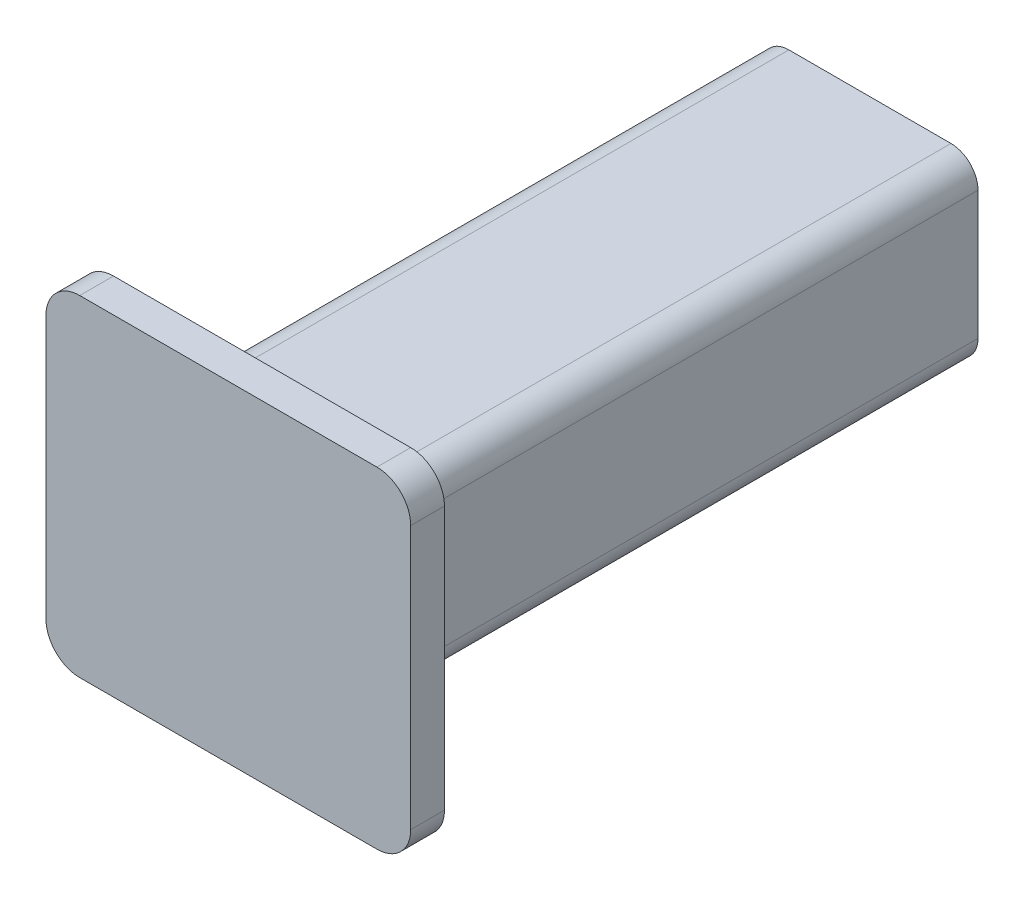
ISO-10303-21;
HEADER;
FILE_DESCRIPTION(('STEP AP214'),'2;1');
FILE_NAME('part.step','',(''),(''),'','','');
FILE_SCHEMA(('AUTOMOTIVE_DESIGN { 1 0 10303 214 1 1 1 1 }'));
ENDSEC;
DATA;
#1=APPLICATION_CONTEXT('core data for automotive mechanical design processes');
#2=APPLICATION_PROTOCOL_DEFINITION('international standard','automotive_design',2000,#1);
#3=PRODUCT_CONTEXT('',#1,'mechanical');
#4=PRODUCT('Part','Part','',(#3));
#5=PRODUCT_RELATED_PRODUCT_CATEGORY('part','',(#4));
#6=PRODUCT_DEFINITION_FORMATION('','',#4);
#7=PRODUCT_DEFINITION_CONTEXT('part definition',#1,'design');
#8=PRODUCT_DEFINITION('design','',#6,#7);
#9=PRODUCT_DEFINITION_SHAPE('','',#8);
#10=(LENGTH_UNIT() NAMED_UNIT(*) SI_UNIT(.MILLI.,.METRE.));
#11=(NAMED_UNIT(*) PLANE_ANGLE_UNIT() SI_UNIT($,.RADIAN.));
#12=(NAMED_UNIT(*) SI_UNIT($,.STERADIAN.) SOLID_ANGLE_UNIT());
#13=UNCERTAINTY_MEASURE_WITH_UNIT(LENGTH_MEASURE(1.E-05),#10,'distance_accuracy_value','');
#14=(GEOMETRIC_REPRESENTATION_CONTEXT(3) GLOBAL_UNCERTAINTY_ASSIGNED_CONTEXT((#13)) GLOBAL_UNIT_ASSIGNED_CONTEXT((#10,
#11,#12)) REPRESENTATION_CONTEXT('',''));
#15=CARTESIAN_POINT('',(0.,0.,0.));
#16=DIRECTION('',(0.,0.,1.));
#17=DIRECTION('',(1.,0.,0.));
#18=AXIS2_PLACEMENT_3D('',#15,#16,#17);
#19=CARTESIAN_POINT('',(5.66715121239576,-1.47845303106902,0.));
#20=DIRECTION('',(0.,0.,1.));
#21=DIRECTION('',(1.,0.,0.));
#22=AXIS2_PLACEMENT_3D('',#19,#20,#21);
#23=PLANE('',#22);
#24=CARTESIAN_POINT('',(5.66715121239576,-1.47845303106902,0.));
#25=DIRECTION('',(0.,0.,1.));
#26=DIRECTION('',(1.,0.,0.));
#27=AXIS2_PLACEMENT_3D('',#24,#25,#26);
#28=CIRCLE('',#27,1.);
#29=CARTESIAN_POINT('',(5.66715121239576,-2.47845303106902,0.));
#30=VERTEX_POINT('',#29);
#31=CARTESIAN_POINT('',(6.66715121239576,-1.47845303106902,0.));
#32=VERTEX_POINT('',#31);
#33=EDGE_CURVE('E178',#30,#32,#28,.T.);
#34=ORIENTED_EDGE('',*,*,#33,.F.);
#35=DIRECTION('',(1.,0.,0.));
#36=VECTOR('',#35,1.);
#37=CARTESIAN_POINT('',(-3.13284878760424,-2.47845303106902,0.));
#38=LINE('',#37,#36);
#39=CARTESIAN_POINT('',(-3.13284878760424,-2.47845303106902,0.));
#40=VERTEX_POINT('',#39);
#41=EDGE_CURVE('E191',#40,#30,#38,.T.);
#42=ORIENTED_EDGE('',*,*,#41,.F.);
#43=CARTESIAN_POINT('',(-3.13284878760424,-1.47845303106902,0.));
#44=DIRECTION('',(0.,0.,1.));
#45=DIRECTION('',(1.,0.,0.));
#46=AXIS2_PLACEMENT_3D('',#43,#44,#45);
#47=CIRCLE('',#46,1.);
#48=CARTESIAN_POINT('',(-4.13284878760424,-1.47845303106901,0.));
#49=VERTEX_POINT('',#48);
#50=EDGE_CURVE('E215',#49,#40,#47,.T.);
#51=ORIENTED_EDGE('',*,*,#50,.F.);
#52=DIRECTION('',(0.,-1.,0.));
#53=VECTOR('',#52,1.);
#54=CARTESIAN_POINT('',(-4.13284878760424,6.32154696893098,0.));
#55=LINE('',#54,#53);
#56=CARTESIAN_POINT('',(-4.13284878760424,6.32154696893098,0.));
#57=VERTEX_POINT('',#56);
#58=EDGE_CURVE('E213',#57,#49,#55,.T.);
#59=ORIENTED_EDGE('',*,*,#58,.F.);
#60=CARTESIAN_POINT('',(-3.13284878760424,6.32154696893098,0.));
#61=DIRECTION('',(0.,0.,1.));
#62=DIRECTION('',(1.,0.,0.));
#63=AXIS2_PLACEMENT_3D('',#60,#61,#62);
#64=CIRCLE('',#63,1.);
#65=CARTESIAN_POINT('',(-3.13284878760424,7.32154696893098,0.));
#66=VERTEX_POINT('',#65);
#67=EDGE_CURVE('E211',#66,#57,#64,.T.);
#68=ORIENTED_EDGE('',*,*,#67,.F.);
#69=DIRECTION('',(-1.,0.,0.));
#70=VECTOR('',#69,1.);
#71=CARTESIAN_POINT('',(-3.13284878760424,7.32154696893098,0.));
#72=LINE('',#71,#70);
#73=CARTESIAN_POINT('',(5.66715121239576,7.32154696893098,0.));
#74=VERTEX_POINT('',#73);
#75=EDGE_CURVE('E209',#74,#66,#72,.T.);
#76=ORIENTED_EDGE('',*,*,#75,.F.);
#77=CARTESIAN_POINT('',(5.66715121239576,6.32154696893098,0.));
#78=DIRECTION('',(0.,0.,1.));
#79=DIRECTION('',(-1.,0.,0.));
#80=AXIS2_PLACEMENT_3D('',#77,#78,#79);
#81=CIRCLE('',#80,1.);
#82=CARTESIAN_POINT('',(6.66715121239576,6.32154696893098,0.));
#83=VERTEX_POINT('',#82);
#84=EDGE_CURVE('E207',#83,#74,#81,.T.);
#85=ORIENTED_EDGE('',*,*,#84,.F.);
#86=DIRECTION('',(0.,1.,0.));
#87=VECTOR('',#86,1.);
#88=CARTESIAN_POINT('',(6.66715121239576,6.32154696893098,0.));
#89=LINE('',#88,#87);
#90=EDGE_CURVE('E181',#32,#83,#89,.T.);
#91=ORIENTED_EDGE('',*,*,#90,.F.);
#92=EDGE_LOOP('',(#34,#42,#51,#59,#68,#76,#85,#91));
#93=FACE_BOUND('',#92,.T.);
#94=CARTESIAN_POINT('',(3.66715121239576,0.52154696893098,0.));
#95=DIRECTION('',(0.,0.,-1.));
#96=DIRECTION('',(-1.,0.,0.));
#97=AXIS2_PLACEMENT_3D('',#94,#95,#96);
#98=CIRCLE('',#97,0.8);
#99=CARTESIAN_POINT('',(4.46715121239576,0.52154696893098,0.));
#100=VERTEX_POINT('',#99);
#101=CARTESIAN_POINT('',(3.66715121239576,-0.27845303106902,0.));
#102=VERTEX_POINT('',#101);
#103=EDGE_CURVE('E60',#100,#102,#98,.T.);
#104=ORIENTED_EDGE('',*,*,#103,.F.);
#105=DIRECTION('',(0.,-1.,0.));
#106=VECTOR('',#105,1.);
#107=CARTESIAN_POINT('',(4.46715121239576,4.32154696893098,0.));
#108=LINE('',#107,#106);
#109=CARTESIAN_POINT('',(4.46715121239576,4.32154696893098,0.));
#110=VERTEX_POINT('',#109);
#111=EDGE_CURVE('E64',#110,#100,#108,.T.);
#112=ORIENTED_EDGE('',*,*,#111,.F.);
#113=CARTESIAN_POINT('',(3.66715121239576,4.32154696893098,0.));
#114=DIRECTION('',(0.,0.,-1.));
#115=DIRECTION('',(-1.,0.,0.));
#116=AXIS2_PLACEMENT_3D('',#113,#114,#115);
#117=CIRCLE('',#116,0.8);
#118=CARTESIAN_POINT('',(3.66715121239576,5.12154696893098,0.));
#119=VERTEX_POINT('',#118);
#120=EDGE_CURVE('E441',#119,#110,#117,.T.);
#121=ORIENTED_EDGE('',*,*,#120,.F.);
#122=DIRECTION('',(1.,0.,0.));
#123=VECTOR('',#122,1.);
#124=CARTESIAN_POINT('',(3.66715121239576,5.12154696893098,0.));
#125=LINE('',#124,#123);
#126=CARTESIAN_POINT('',(-1.13284878760424,5.12154696893098,0.));
#127=VERTEX_POINT('',#126);
#128=EDGE_CURVE('E475',#127,#119,#125,.T.);
#129=ORIENTED_EDGE('',*,*,#128,.F.);
#130=CARTESIAN_POINT('',(-1.13284878760424,4.32154696893098,0.));
#131=DIRECTION('',(0.,0.,-1.));
#132=DIRECTION('',(1.,0.,0.));
#133=AXIS2_PLACEMENT_3D('',#130,#131,#132);
#134=CIRCLE('',#133,0.8);
#135=CARTESIAN_POINT('',(-1.93284878760424,4.32154696893098,0.));
#136=VERTEX_POINT('',#135);
#137=EDGE_CURVE('E468',#136,#127,#134,.T.);
#138=ORIENTED_EDGE('',*,*,#137,.F.);
#139=DIRECTION('',(0.,1.,0.));
#140=VECTOR('',#139,1.);
#141=CARTESIAN_POINT('',(-1.93284878760424,4.32154696893098,0.));
#142=LINE('',#141,#140);
#143=CARTESIAN_POINT('',(-1.93284878760424,0.52154696893098,0.));
#144=VERTEX_POINT('',#143);
#145=EDGE_CURVE('E462',#144,#136,#142,.T.);
#146=ORIENTED_EDGE('',*,*,#145,.F.);
#147=CARTESIAN_POINT('',(-1.13284878760424,0.52154696893098,0.));
#148=DIRECTION('',(0.,0.,-1.));
#149=DIRECTION('',(-1.,0.,0.));
#150=AXIS2_PLACEMENT_3D('',#147,#148,#149);
#151=CIRCLE('',#150,0.8);
#152=CARTESIAN_POINT('',(-1.13284878760424,-0.27845303106902,0.));
#153=VERTEX_POINT('',#152);
#154=EDGE_CURVE('E465',#153,#144,#151,.T.);
#155=ORIENTED_EDGE('',*,*,#154,.F.);
#156=DIRECTION('',(-1.,0.,0.));
#157=VECTOR('',#156,1.);
#158=CARTESIAN_POINT('',(3.66715121239576,-0.27845303106902,0.));
#159=LINE('',#158,#157);
#160=EDGE_CURVE('E466',#102,#153,#159,.T.);
#161=ORIENTED_EDGE('',*,*,#160,.F.);
#162=EDGE_LOOP('',(#104,#112,#121,#129,#138,#146,#155,#161));
#163=FACE_BOUND('',#162,.T.);
#164=ADVANCED_FACE('F45',(#93,#163),#23,.F.);
#165=CARTESIAN_POINT('',(5.66715121239576,-1.47845303106902,1.));
#166=DIRECTION('',(0.,0.,-1.));
#167=DIRECTION('',(-1.,0.,0.));
#168=AXIS2_PLACEMENT_3D('',#165,#166,#167);
#169=CYLINDRICAL_SURFACE('',#168,1.);
#170=ORIENTED_EDGE('',*,*,#33,.T.);
#171=DIRECTION('',(0.,0.,-1.));
#172=VECTOR('',#171,1.);
#173=CARTESIAN_POINT('',(6.66715121239576,-1.47845303106902,1.));
#174=LINE('',#173,#172);
#175=CARTESIAN_POINT('',(6.66715121239576,-1.47845303106902,1.));
#176=VERTEX_POINT('',#175);
#177=EDGE_CURVE('E11',#176,#32,#174,.T.);
#178=ORIENTED_EDGE('',*,*,#177,.F.);
#179=CARTESIAN_POINT('',(5.66715121239576,-1.47845303106902,1.));
#180=DIRECTION('',(0.,0.,1.));
#181=DIRECTION('',(1.,0.,0.));
#182=AXIS2_PLACEMENT_3D('',#179,#180,#181);
#183=CIRCLE('',#182,1.);
#184=CARTESIAN_POINT('',(5.66715121239576,-2.47845303106902,1.));
#185=VERTEX_POINT('',#184);
#186=EDGE_CURVE('E187',#185,#176,#183,.T.);
#187=ORIENTED_EDGE('',*,*,#186,.F.);
#188=DIRECTION('',(0.,0.,-1.));
#189=VECTOR('',#188,1.);
#190=CARTESIAN_POINT('',(5.66715121239576,-2.47845303106902,1.));
#191=LINE('',#190,#189);
#192=EDGE_CURVE('E204',#185,#30,#191,.T.);
#193=ORIENTED_EDGE('',*,*,#192,.T.);
#194=EDGE_LOOP('',(#170,#178,#187,#193));
#195=FACE_BOUND('',#194,.T.);
#196=ADVANCED_FACE('F47',(#195),#169,.T.);
#197=CARTESIAN_POINT('',(6.66715121239576,6.32154696893098,1.));
#198=DIRECTION('',(-1.,0.,0.));
#199=DIRECTION('',(0.,-1.,0.));
#200=AXIS2_PLACEMENT_3D('',#197,#198,#199);
#201=PLANE('',#200);
#202=ORIENTED_EDGE('',*,*,#90,.T.);
#203=DIRECTION('',(0.,0.,-1.));
#204=VECTOR('',#203,1.);
#205=CARTESIAN_POINT('',(6.66715121239576,6.32154696893098,1.));
#206=LINE('',#205,#204);
#207=CARTESIAN_POINT('',(6.66715121239576,6.32154696893098,1.));
#208=VERTEX_POINT('',#207);
#209=EDGE_CURVE('E53',#208,#83,#206,.T.);
#210=ORIENTED_EDGE('',*,*,#209,.F.);
#211=DIRECTION('',(0.,1.,0.));
#212=VECTOR('',#211,1.);
#213=CARTESIAN_POINT('',(6.66715121239576,6.32154696893098,1.));
#214=LINE('',#213,#212);
#215=EDGE_CURVE('E190',#176,#208,#214,.T.);
#216=ORIENTED_EDGE('',*,*,#215,.F.);
#217=ORIENTED_EDGE('',*,*,#177,.T.);
#218=EDGE_LOOP('',(#202,#210,#216,#217));
#219=FACE_BOUND('',#218,.T.);
#220=ADVANCED_FACE('F261',(#219),#201,.F.);
#221=CARTESIAN_POINT('',(5.66715121239576,6.32154696893098,1.));
#222=DIRECTION('',(0.,0.,-1.));
#223=DIRECTION('',(-1.,0.,0.));
#224=AXIS2_PLACEMENT_3D('',#221,#222,#223);
#225=CYLINDRICAL_SURFACE('',#224,1.);
#226=ORIENTED_EDGE('',*,*,#84,.T.);
#227=DIRECTION('',(0.,0.,-1.));
#228=VECTOR('',#227,1.);
#229=CARTESIAN_POINT('',(5.66715121239576,7.32154696893098,1.));
#230=LINE('',#229,#228);
#231=CARTESIAN_POINT('',(5.66715121239576,7.32154696893098,1.));
#232=VERTEX_POINT('',#231);
#233=EDGE_CURVE('E232',#232,#74,#230,.T.);
#234=ORIENTED_EDGE('',*,*,#233,.F.);
#235=CARTESIAN_POINT('',(5.66715121239576,6.32154696893098,1.));
#236=DIRECTION('',(0.,0.,1.));
#237=DIRECTION('',(-1.,0.,0.));
#238=AXIS2_PLACEMENT_3D('',#235,#236,#237);
#239=CIRCLE('',#238,1.);
#240=EDGE_CURVE('E193',#208,#232,#239,.T.);
#241=ORIENTED_EDGE('',*,*,#240,.F.);
#242=ORIENTED_EDGE('',*,*,#209,.T.);
#243=EDGE_LOOP('',(#226,#234,#241,#242));
#244=FACE_BOUND('',#243,.T.);
#245=ADVANCED_FACE('F239',(#244),#225,.T.);
#246=CARTESIAN_POINT('',(-3.13284878760424,7.32154696893098,1.));
#247=DIRECTION('',(0.,-1.,0.));
#248=DIRECTION('',(0.,0.,-1.));
#249=AXIS2_PLACEMENT_3D('',#246,#247,#248);
#250=PLANE('',#249);
#251=ORIENTED_EDGE('',*,*,#75,.T.);
#252=DIRECTION('',(0.,0.,-1.));
#253=VECTOR('',#252,1.);
#254=CARTESIAN_POINT('',(-3.13284878760424,7.32154696893098,1.));
#255=LINE('',#254,#253);
#256=CARTESIAN_POINT('',(-3.13284878760424,7.32154696893098,1.));
#257=VERTEX_POINT('',#256);
#258=EDGE_CURVE('E229',#257,#66,#255,.T.);
#259=ORIENTED_EDGE('',*,*,#258,.F.);
#260=DIRECTION('',(-1.,0.,0.));
#261=VECTOR('',#260,1.);
#262=CARTESIAN_POINT('',(-3.13284878760424,7.32154696893098,1.));
#263=LINE('',#262,#261);
#264=EDGE_CURVE('E195',#232,#257,#263,.T.);
#265=ORIENTED_EDGE('',*,*,#264,.F.);
#266=ORIENTED_EDGE('',*,*,#233,.T.);
#267=EDGE_LOOP('',(#251,#259,#265,#266));
#268=FACE_BOUND('',#267,.T.);
#269=ADVANCED_FACE('F249',(#268),#250,.F.);
#270=CARTESIAN_POINT('',(-3.13284878760424,6.32154696893098,1.));
#271=DIRECTION('',(0.,0.,-1.));
#272=DIRECTION('',(-1.,0.,0.));
#273=AXIS2_PLACEMENT_3D('',#270,#271,#272);
#274=CYLINDRICAL_SURFACE('',#273,1.);
#275=ORIENTED_EDGE('',*,*,#67,.T.);
#276=DIRECTION('',(0.,0.,-1.));
#277=VECTOR('',#276,1.);
#278=CARTESIAN_POINT('',(-4.13284878760424,6.32154696893098,1.));
#279=LINE('',#278,#277);
#280=CARTESIAN_POINT('',(-4.13284878760424,6.32154696893098,1.));
#281=VERTEX_POINT('',#280);
#282=EDGE_CURVE('E226',#281,#57,#279,.T.);
#283=ORIENTED_EDGE('',*,*,#282,.F.);
#284=CARTESIAN_POINT('',(-3.13284878760424,6.32154696893098,1.));
#285=DIRECTION('',(0.,0.,1.));
#286=DIRECTION('',(1.,0.,0.));
#287=AXIS2_PLACEMENT_3D('',#284,#285,#286);
#288=CIRCLE('',#287,1.);
#289=EDGE_CURVE('E197',#257,#281,#288,.T.);
#290=ORIENTED_EDGE('',*,*,#289,.F.);
#291=ORIENTED_EDGE('',*,*,#258,.T.);
#292=EDGE_LOOP('',(#275,#283,#290,#291));
#293=FACE_BOUND('',#292,.T.);
#294=ADVANCED_FACE('F253',(#293),#274,.T.);
#295=CARTESIAN_POINT('',(-4.13284878760424,6.32154696893098,1.));
#296=DIRECTION('',(1.,0.,0.));
#297=DIRECTION('',(0.,0.,-1.));
#298=AXIS2_PLACEMENT_3D('',#295,#296,#297);
#299=PLANE('',#298);
#300=ORIENTED_EDGE('',*,*,#58,.T.);
#301=DIRECTION('',(0.,0.,-1.));
#302=VECTOR('',#301,1.);
#303=CARTESIAN_POINT('',(-4.13284878760424,-1.47845303106901,1.));
#304=LINE('',#303,#302);
#305=CARTESIAN_POINT('',(-4.13284878760424,-1.47845303106901,1.));
#306=VERTEX_POINT('',#305);
#307=EDGE_CURVE('E223',#306,#49,#304,.T.);
#308=ORIENTED_EDGE('',*,*,#307,.F.);
#309=DIRECTION('',(0.,-1.,0.));
#310=VECTOR('',#309,1.);
#311=CARTESIAN_POINT('',(-4.13284878760424,6.32154696893098,1.));
#312=LINE('',#311,#310);
#313=EDGE_CURVE('E199',#281,#306,#312,.T.);
#314=ORIENTED_EDGE('',*,*,#313,.F.);
#315=ORIENTED_EDGE('',*,*,#282,.T.);
#316=EDGE_LOOP('',(#300,#308,#314,#315));
#317=FACE_BOUND('',#316,.T.);
#318=ADVANCED_FACE('F274',(#317),#299,.F.);
#319=CARTESIAN_POINT('',(-3.13284878760424,-1.47845303106902,1.));
#320=DIRECTION('',(0.,0.,-1.));
#321=DIRECTION('',(-1.,0.,0.));
#322=AXIS2_PLACEMENT_3D('',#319,#320,#321);
#323=CYLINDRICAL_SURFACE('',#322,1.);
#324=ORIENTED_EDGE('',*,*,#50,.T.);
#325=DIRECTION('',(0.,0.,-1.));
#326=VECTOR('',#325,1.);
#327=CARTESIAN_POINT('',(-3.13284878760424,-2.47845303106902,1.));
#328=LINE('',#327,#326);
#329=CARTESIAN_POINT('',(-3.13284878760424,-2.47845303106902,1.));
#330=VERTEX_POINT('',#329);
#331=EDGE_CURVE('E220',#330,#40,#328,.T.);
#332=ORIENTED_EDGE('',*,*,#331,.F.);
#333=CARTESIAN_POINT('',(-3.13284878760424,-1.47845303106902,1.));
#334=DIRECTION('',(0.,0.,1.));
#335=DIRECTION('',(1.,0.,0.));
#336=AXIS2_PLACEMENT_3D('',#333,#334,#335);
#337=CIRCLE('',#336,1.);
#338=EDGE_CURVE('E201',#306,#330,#337,.T.);
#339=ORIENTED_EDGE('',*,*,#338,.F.);
#340=ORIENTED_EDGE('',*,*,#307,.T.);
#341=EDGE_LOOP('',(#324,#332,#339,#340));
#342=FACE_BOUND('',#341,.T.);
#343=ADVANCED_FACE('F272',(#342),#323,.T.);
#344=CARTESIAN_POINT('',(-3.13284878760424,-2.47845303106902,1.));
#345=DIRECTION('',(0.,1.,0.));
#346=DIRECTION('',(-1.,0.,0.));
#347=AXIS2_PLACEMENT_3D('',#344,#345,#346);
#348=PLANE('',#347);
#349=ORIENTED_EDGE('',*,*,#41,.T.);
#350=ORIENTED_EDGE('',*,*,#192,.F.);
#351=DIRECTION('',(1.,0.,0.));
#352=VECTOR('',#351,1.);
#353=CARTESIAN_POINT('',(-3.13284878760424,-2.47845303106902,1.));
#354=LINE('',#353,#352);
#355=EDGE_CURVE('E203',#330,#185,#354,.T.);
#356=ORIENTED_EDGE('',*,*,#355,.F.);
#357=ORIENTED_EDGE('',*,*,#331,.T.);
#358=EDGE_LOOP('',(#349,#350,#356,#357));
#359=FACE_BOUND('',#358,.T.);
#360=ADVANCED_FACE('F267',(#359),#348,.F.);
#361=CARTESIAN_POINT('',(5.66715121239576,-1.47845303106902,1.));
#362=DIRECTION('',(0.,0.,1.));
#363=DIRECTION('',(1.,0.,0.));
#364=AXIS2_PLACEMENT_3D('',#361,#362,#363);
#365=PLANE('',#364);
#366=ORIENTED_EDGE('',*,*,#186,.T.);
#367=ORIENTED_EDGE('',*,*,#215,.T.);
#368=ORIENTED_EDGE('',*,*,#240,.T.);
#369=ORIENTED_EDGE('',*,*,#264,.T.);
#370=ORIENTED_EDGE('',*,*,#289,.T.);
#371=ORIENTED_EDGE('',*,*,#313,.T.);
#372=ORIENTED_EDGE('',*,*,#338,.T.);
#373=ORIENTED_EDGE('',*,*,#355,.T.);
#374=EDGE_LOOP('',(#366,#367,#368,#369,#370,#371,#372,#373));
#375=FACE_BOUND('',#374,.T.);
#376=ADVANCED_FACE('F257',(#375),#365,.T.);
#377=CARTESIAN_POINT('',(3.66715121239576,0.52154696893098,-18.));
#378=DIRECTION('',(0.,0.,1.));
#379=DIRECTION('',(1.,0.,0.));
#380=AXIS2_PLACEMENT_3D('',#377,#378,#379);
#381=CYLINDRICAL_SURFACE('',#380,0.8);
#382=ORIENTED_EDGE('',*,*,#103,.T.);
#383=DIRECTION('',(0.,0.,1.));
#384=VECTOR('',#383,1.);
#385=CARTESIAN_POINT('',(3.66715121239576,-0.27845303106902,-18.));
#386=LINE('',#385,#384);
#387=CARTESIAN_POINT('',(3.66715121239576,-0.27845303106902,-18.));
#388=VERTEX_POINT('',#387);
#389=EDGE_CURVE('E161',#388,#102,#386,.T.);
#390=ORIENTED_EDGE('',*,*,#389,.F.);
#391=CARTESIAN_POINT('',(3.66715121239576,0.52154696893098,-18.));
#392=DIRECTION('',(0.,0.,-1.));
#393=DIRECTION('',(-1.,0.,0.));
#394=AXIS2_PLACEMENT_3D('',#391,#392,#393);
#395=CIRCLE('',#394,0.8);
#396=CARTESIAN_POINT('',(4.46715121239576,0.52154696893098,-18.));
#397=VERTEX_POINT('',#396);
#398=EDGE_CURVE('E167',#397,#388,#395,.T.);
#399=ORIENTED_EDGE('',*,*,#398,.F.);
#400=DIRECTION('',(0.,0.,1.));
#401=VECTOR('',#400,1.);
#402=CARTESIAN_POINT('',(4.46715121239576,0.52154696893098,-18.));
#403=LINE('',#402,#401);
#404=EDGE_CURVE('E438',#397,#100,#403,.T.);
#405=ORIENTED_EDGE('',*,*,#404,.T.);
#406=EDGE_LOOP('',(#382,#390,#399,#405));
#407=FACE_BOUND('',#406,.T.);
#408=ADVANCED_FACE('F177',(#407),#381,.T.);
#409=CARTESIAN_POINT('',(3.66715121239576,-0.27845303106902,-18.));
#410=DIRECTION('',(0.,1.,0.));
#411=DIRECTION('',(0.,0.,1.));
#412=AXIS2_PLACEMENT_3D('',#409,#410,#411);
#413=PLANE('',#412);
#414=ORIENTED_EDGE('',*,*,#160,.T.);
#415=DIRECTION('',(0.,0.,1.));
#416=VECTOR('',#415,1.);
#417=CARTESIAN_POINT('',(-1.13284878760424,-0.27845303106902,-18.));
#418=LINE('',#417,#416);
#419=CARTESIAN_POINT('',(-1.13284878760424,-0.27845303106902,-18.));
#420=VERTEX_POINT('',#419);
#421=EDGE_CURVE('E163',#420,#153,#418,.T.);
#422=ORIENTED_EDGE('',*,*,#421,.F.);
#423=DIRECTION('',(-1.,0.,0.));
#424=VECTOR('',#423,1.);
#425=CARTESIAN_POINT('',(3.66715121239576,-0.27845303106902,-18.));
#426=LINE('',#425,#424);
#427=EDGE_CURVE('E156',#388,#420,#426,.T.);
#428=ORIENTED_EDGE('',*,*,#427,.F.);
#429=ORIENTED_EDGE('',*,*,#389,.T.);
#430=EDGE_LOOP('',(#414,#422,#428,#429));
#431=FACE_BOUND('',#430,.T.);
#432=ADVANCED_FACE('F159',(#431),#413,.F.);
#433=CARTESIAN_POINT('',(-1.13284878760424,0.52154696893098,-18.));
#434=DIRECTION('',(0.,0.,1.));
#435=DIRECTION('',(1.,0.,0.));
#436=AXIS2_PLACEMENT_3D('',#433,#434,#435);
#437=CYLINDRICAL_SURFACE('',#436,0.8);
#438=ORIENTED_EDGE('',*,*,#154,.T.);
#439=DIRECTION('',(0.,0.,1.));
#440=VECTOR('',#439,1.);
#441=CARTESIAN_POINT('',(-1.93284878760424,0.52154696893098,-18.));
#442=LINE('',#441,#440);
#443=CARTESIAN_POINT('',(-1.93284878760424,0.52154696893098,-18.));
#444=VERTEX_POINT('',#443);
#445=EDGE_CURVE('E183',#444,#144,#442,.T.);
#446=ORIENTED_EDGE('',*,*,#445,.F.);
#447=CARTESIAN_POINT('',(-1.13284878760424,0.52154696893098,-18.));
#448=DIRECTION('',(0.,0.,-1.));
#449=DIRECTION('',(-1.,0.,0.));
#450=AXIS2_PLACEMENT_3D('',#447,#448,#449);
#451=CIRCLE('',#450,0.8);
#452=EDGE_CURVE('E166',#420,#444,#451,.T.);
#453=ORIENTED_EDGE('',*,*,#452,.F.);
#454=ORIENTED_EDGE('',*,*,#421,.T.);
#455=EDGE_LOOP('',(#438,#446,#453,#454));
#456=FACE_BOUND('',#455,.T.);
#457=ADVANCED_FACE('F301',(#456),#437,.T.);
#458=CARTESIAN_POINT('',(-1.93284878760424,4.32154696893098,-18.));
#459=DIRECTION('',(1.,0.,0.));
#460=DIRECTION('',(0.,1.,0.));
#461=AXIS2_PLACEMENT_3D('',#458,#459,#460);
#462=PLANE('',#461);
#463=ORIENTED_EDGE('',*,*,#145,.T.);
#464=DIRECTION('',(0.,0.,1.));
#465=VECTOR('',#464,1.);
#466=CARTESIAN_POINT('',(-1.93284878760424,4.32154696893098,-18.));
#467=LINE('',#466,#465);
#468=CARTESIAN_POINT('',(-1.93284878760424,4.32154696893098,-18.));
#469=VERTEX_POINT('',#468);
#470=EDGE_CURVE('E455',#469,#136,#467,.T.);
#471=ORIENTED_EDGE('',*,*,#470,.F.);
#472=DIRECTION('',(0.,1.,0.));
#473=VECTOR('',#472,1.);
#474=CARTESIAN_POINT('',(-1.93284878760424,4.32154696893098,-18.));
#475=LINE('',#474,#473);
#476=EDGE_CURVE('E463',#444,#469,#475,.T.);
#477=ORIENTED_EDGE('',*,*,#476,.F.);
#478=ORIENTED_EDGE('',*,*,#445,.T.);
#479=EDGE_LOOP('',(#463,#471,#477,#478));
#480=FACE_BOUND('',#479,.T.);
#481=ADVANCED_FACE('F306',(#480),#462,.F.);
#482=CARTESIAN_POINT('',(-1.13284878760424,4.32154696893098,-18.));
#483=DIRECTION('',(0.,0.,1.));
#484=DIRECTION('',(1.,0.,0.));
#485=AXIS2_PLACEMENT_3D('',#482,#483,#484);
#486=CYLINDRICAL_SURFACE('',#485,0.8);
#487=ORIENTED_EDGE('',*,*,#137,.T.);
#488=DIRECTION('',(0.,0.,1.));
#489=VECTOR('',#488,1.);
#490=CARTESIAN_POINT('',(-1.13284878760424,5.12154696893098,-18.));
#491=LINE('',#490,#489);
#492=CARTESIAN_POINT('',(-1.13284878760424,5.12154696893098,-18.));
#493=VERTEX_POINT('',#492);
#494=EDGE_CURVE('E452',#493,#127,#491,.T.);
#495=ORIENTED_EDGE('',*,*,#494,.F.);
#496=CARTESIAN_POINT('',(-1.13284878760424,4.32154696893098,-18.));
#497=DIRECTION('',(0.,0.,-1.));
#498=DIRECTION('',(1.,0.,0.));
#499=AXIS2_PLACEMENT_3D('',#496,#497,#498);
#500=CIRCLE('',#499,0.8);
#501=EDGE_CURVE('E483',#469,#493,#500,.T.);
#502=ORIENTED_EDGE('',*,*,#501,.F.);
#503=ORIENTED_EDGE('',*,*,#470,.T.);
#504=EDGE_LOOP('',(#487,#495,#502,#503));
#505=FACE_BOUND('',#504,.T.);
#506=ADVANCED_FACE('F310',(#505),#486,.T.);
#507=CARTESIAN_POINT('',(3.66715121239576,5.12154696893098,-18.));
#508=DIRECTION('',(0.,-1.,0.));
#509=DIRECTION('',(0.,0.,-1.));
#510=AXIS2_PLACEMENT_3D('',#507,#508,#509);
#511=PLANE('',#510);
#512=ORIENTED_EDGE('',*,*,#128,.T.);
#513=DIRECTION('',(0.,0.,1.));
#514=VECTOR('',#513,1.);
#515=CARTESIAN_POINT('',(3.66715121239576,5.12154696893098,-18.));
#516=LINE('',#515,#514);
#517=CARTESIAN_POINT('',(3.66715121239576,5.12154696893098,-18.));
#518=VERTEX_POINT('',#517);
#519=EDGE_CURVE('E444',#518,#119,#516,.T.);
#520=ORIENTED_EDGE('',*,*,#519,.F.);
#521=DIRECTION('',(1.,0.,0.));
#522=VECTOR('',#521,1.);
#523=CARTESIAN_POINT('',(3.66715121239576,5.12154696893098,-18.));
#524=LINE('',#523,#522);
#525=EDGE_CURVE('E481',#493,#518,#524,.T.);
#526=ORIENTED_EDGE('',*,*,#525,.F.);
#527=ORIENTED_EDGE('',*,*,#494,.T.);
#528=EDGE_LOOP('',(#512,#520,#526,#527));
#529=FACE_BOUND('',#528,.T.);
#530=ADVANCED_FACE('F314',(#529),#511,.F.);
#531=CARTESIAN_POINT('',(3.66715121239576,4.32154696893098,-18.));
#532=DIRECTION('',(0.,0.,1.));
#533=DIRECTION('',(1.,0.,0.));
#534=AXIS2_PLACEMENT_3D('',#531,#532,#533);
#535=CYLINDRICAL_SURFACE('',#534,0.8);
#536=ORIENTED_EDGE('',*,*,#120,.T.);
#537=DIRECTION('',(0.,0.,1.));
#538=VECTOR('',#537,1.);
#539=CARTESIAN_POINT('',(4.46715121239576,4.32154696893098,-18.));
#540=LINE('',#539,#538);
#541=CARTESIAN_POINT('',(4.46715121239576,4.32154696893098,-18.));
#542=VERTEX_POINT('',#541);
#543=EDGE_CURVE('E440',#542,#110,#540,.T.);
#544=ORIENTED_EDGE('',*,*,#543,.F.);
#545=CARTESIAN_POINT('',(3.66715121239576,4.32154696893098,-18.));
#546=DIRECTION('',(0.,0.,-1.));
#547=DIRECTION('',(-1.,0.,0.));
#548=AXIS2_PLACEMENT_3D('',#545,#546,#547);
#549=CIRCLE('',#548,0.8);
#550=EDGE_CURVE('E446',#518,#542,#549,.T.);
#551=ORIENTED_EDGE('',*,*,#550,.F.);
#552=ORIENTED_EDGE('',*,*,#519,.T.);
#553=EDGE_LOOP('',(#536,#544,#551,#552));
#554=FACE_BOUND('',#553,.T.);
#555=ADVANCED_FACE('F318',(#554),#535,.T.);
#556=CARTESIAN_POINT('',(4.46715121239576,4.32154696893098,-18.));
#557=DIRECTION('',(-1.,0.,0.));
#558=DIRECTION('',(0.,0.,1.));
#559=AXIS2_PLACEMENT_3D('',#556,#557,#558);
#560=PLANE('',#559);
#561=ORIENTED_EDGE('',*,*,#111,.T.);
#562=ORIENTED_EDGE('',*,*,#404,.F.);
#563=DIRECTION('',(0.,-1.,0.));
#564=VECTOR('',#563,1.);
#565=CARTESIAN_POINT('',(4.46715121239576,4.32154696893098,-18.));
#566=LINE('',#565,#564);
#567=EDGE_CURVE('E172',#542,#397,#566,.T.);
#568=ORIENTED_EDGE('',*,*,#567,.F.);
#569=ORIENTED_EDGE('',*,*,#543,.T.);
#570=EDGE_LOOP('',(#561,#562,#568,#569));
#571=FACE_BOUND('',#570,.T.);
#572=ADVANCED_FACE('F322',(#571),#560,.F.);
#573=CARTESIAN_POINT('',(3.66715121239576,0.52154696893098,-18.));
#574=DIRECTION('',(0.,0.,-1.));
#575=DIRECTION('',(-1.,0.,0.));
#576=AXIS2_PLACEMENT_3D('',#573,#574,#575);
#577=PLANE('',#576);
#578=ORIENTED_EDGE('',*,*,#398,.T.);
#579=ORIENTED_EDGE('',*,*,#427,.T.);
#580=ORIENTED_EDGE('',*,*,#452,.T.);
#581=ORIENTED_EDGE('',*,*,#476,.T.);
#582=ORIENTED_EDGE('',*,*,#501,.T.);
#583=ORIENTED_EDGE('',*,*,#525,.T.);
#584=ORIENTED_EDGE('',*,*,#550,.T.);
#585=ORIENTED_EDGE('',*,*,#567,.T.);
#586=EDGE_LOOP('',(#578,#579,#580,#581,#582,#583,#584,#585));
#587=FACE_BOUND('',#586,.T.);
#588=ADVANCED_FACE('F170',(#587),#577,.T.);
#589=CLOSED_SHELL('',(#164,#196,#220,#245,#269,#294,#318,#343,#360,#376,#408,#432,#457,#481,
#506,#530,#555,#572,#588));
#590=MANIFOLD_SOLID_BREP('B2',#589);
#591=ADVANCED_BREP_SHAPE_REPRESENTATION('',(#18,#590),#14);
#592=SHAPE_DEFINITION_REPRESENTATION(#9,#591);
ENDSEC;
END-ISO-10303-21;
